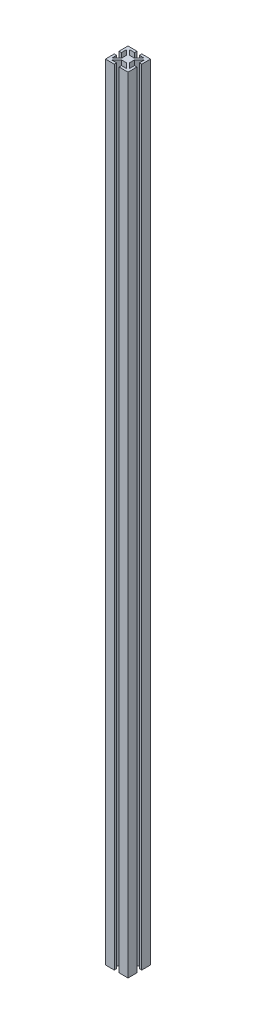
ISO-10303-21;
HEADER;
FILE_DESCRIPTION(('STEP AP214'),'2;1');
FILE_NAME('part.step','',(''),(''),'','','');
FILE_SCHEMA(('AUTOMOTIVE_DESIGN { 1 0 10303 214 1 1 1 1 }'));
ENDSEC;
DATA;
#1=APPLICATION_CONTEXT('core data for automotive mechanical design processes');
#2=APPLICATION_PROTOCOL_DEFINITION('international standard','automotive_design',2000,#1);
#3=PRODUCT_CONTEXT('',#1,'mechanical');
#4=PRODUCT('Part','Part','',(#3));
#5=PRODUCT_RELATED_PRODUCT_CATEGORY('part','',(#4));
#6=PRODUCT_DEFINITION_FORMATION('','',#4);
#7=PRODUCT_DEFINITION_CONTEXT('part definition',#1,'design');
#8=PRODUCT_DEFINITION('design','',#6,#7);
#9=PRODUCT_DEFINITION_SHAPE('','',#8);
#10=(LENGTH_UNIT() NAMED_UNIT(*) SI_UNIT(.MILLI.,.METRE.));
#11=(NAMED_UNIT(*) PLANE_ANGLE_UNIT() SI_UNIT($,.RADIAN.));
#12=(NAMED_UNIT(*) SI_UNIT($,.STERADIAN.) SOLID_ANGLE_UNIT());
#13=UNCERTAINTY_MEASURE_WITH_UNIT(LENGTH_MEASURE(1.E-05),#10,'distance_accuracy_value','');
#14=(GEOMETRIC_REPRESENTATION_CONTEXT(3) GLOBAL_UNCERTAINTY_ASSIGNED_CONTEXT((#13)) GLOBAL_UNIT_ASSIGNED_CONTEXT((#10,
#11,#12)) REPRESENTATION_CONTEXT('',''));
#15=CARTESIAN_POINT('',(0.,0.,0.));
#16=DIRECTION('',(0.,0.,1.));
#17=DIRECTION('',(1.,0.,0.));
#18=AXIS2_PLACEMENT_3D('',#15,#16,#17);
#19=CARTESIAN_POINT('',(-19.05,1320.8,-19.05));
#20=DIRECTION('',(1.,0.,0.));
#21=DIRECTION('',(0.,0.,-1.));
#22=AXIS2_PLACEMENT_3D('',#19,#20,#21);
#23=PLANE('',#22);
#24=DIRECTION('',(0.,0.,1.));
#25=VECTOR('',#24,1.);
#26=CARTESIAN_POINT('',(-19.05,0.,-19.05));
#27=LINE('',#26,#25);
#28=CARTESIAN_POINT('',(-19.05,0.,-19.05));
#29=VERTEX_POINT('',#28);
#30=CARTESIAN_POINT('',(-19.05,0.,-4.06399999999999));
#31=VERTEX_POINT('',#30);
#32=EDGE_CURVE('E299',#29,#31,#27,.T.);
#33=ORIENTED_EDGE('',*,*,#32,.T.);
#34=DIRECTION('',(0.,-1.,0.));
#35=VECTOR('',#34,1.);
#36=CARTESIAN_POINT('',(-19.05,1320.8,-4.06399999999999));
#37=LINE('',#36,#35);
#38=CARTESIAN_POINT('',(-19.05,1320.8,-4.06399999999999));
#39=VERTEX_POINT('',#38);
#40=EDGE_CURVE('E11',#39,#31,#37,.T.);
#41=ORIENTED_EDGE('',*,*,#40,.F.);
#42=DIRECTION('',(0.,0.,1.));
#43=VECTOR('',#42,1.);
#44=CARTESIAN_POINT('',(-19.05,1320.8,-19.05));
#45=LINE('',#44,#43);
#46=CARTESIAN_POINT('',(-19.05,1320.8,-19.05));
#47=VERTEX_POINT('',#46);
#48=EDGE_CURVE('E369',#47,#39,#45,.T.);
#49=ORIENTED_EDGE('',*,*,#48,.F.);
#50=DIRECTION('',(0.,-1.,0.));
#51=VECTOR('',#50,1.);
#52=CARTESIAN_POINT('',(-19.05,1320.8,-19.05));
#53=LINE('',#52,#51);
#54=EDGE_CURVE('E295',#47,#29,#53,.T.);
#55=ORIENTED_EDGE('',*,*,#54,.T.);
#56=EDGE_LOOP('',(#33,#41,#49,#55));
#57=FACE_BOUND('',#56,.T.);
#58=ADVANCED_FACE('F35',(#57),#23,.F.);
#59=CARTESIAN_POINT('',(-19.05,1320.8,-4.06399999999999));
#60=DIRECTION('',(0.,0.,-1.));
#61=DIRECTION('',(-1.,0.,0.));
#62=AXIS2_PLACEMENT_3D('',#59,#60,#61);
#63=PLANE('',#62);
#64=DIRECTION('',(1.,0.,0.));
#65=VECTOR('',#64,1.);
#66=CARTESIAN_POINT('',(-19.05,0.,-4.06399999999999));
#67=LINE('',#66,#65);
#68=CARTESIAN_POINT('',(-14.986,0.,-4.06399999999999));
#69=VERTEX_POINT('',#68);
#70=EDGE_CURVE('E302',#31,#69,#67,.T.);
#71=ORIENTED_EDGE('',*,*,#70,.T.);
#72=DIRECTION('',(0.,-1.,0.));
#73=VECTOR('',#72,1.);
#74=CARTESIAN_POINT('',(-14.986,1320.8,-4.06399999999999));
#75=LINE('',#74,#73);
#76=CARTESIAN_POINT('',(-14.986,1320.8,-4.06399999999999));
#77=VERTEX_POINT('',#76);
#78=EDGE_CURVE('E43',#77,#69,#75,.T.);
#79=ORIENTED_EDGE('',*,*,#78,.F.);
#80=DIRECTION('',(1.,0.,0.));
#81=VECTOR('',#80,1.);
#82=CARTESIAN_POINT('',(-19.05,1320.8,-4.06399999999999));
#83=LINE('',#82,#81);
#84=EDGE_CURVE('E178',#39,#77,#83,.T.);
#85=ORIENTED_EDGE('',*,*,#84,.F.);
#86=ORIENTED_EDGE('',*,*,#40,.T.);
#87=EDGE_LOOP('',(#71,#79,#85,#86));
#88=FACE_BOUND('',#87,.T.);
#89=ADVANCED_FACE('F567',(#88),#63,.F.);
#90=CARTESIAN_POINT('',(-14.986,1320.8,-4.06399999999999));
#91=DIRECTION('',(-1.,0.,0.));
#92=DIRECTION('',(0.,0.,1.));
#93=AXIS2_PLACEMENT_3D('',#90,#91,#92);
#94=PLANE('',#93);
#95=DIRECTION('',(0.,0.,-1.));
#96=VECTOR('',#95,1.);
#97=CARTESIAN_POINT('',(-14.986,0.,-4.06399999999999));
#98=LINE('',#97,#96);
#99=CARTESIAN_POINT('',(-14.986,0.,-12.1123180412578));
#100=VERTEX_POINT('',#99);
#101=EDGE_CURVE('E304',#69,#100,#98,.T.);
#102=ORIENTED_EDGE('',*,*,#101,.T.);
#103=DIRECTION('',(0.,-1.,0.));
#104=VECTOR('',#103,1.);
#105=CARTESIAN_POINT('',(-14.986,1320.8,-12.1123180412578));
#106=LINE('',#105,#104);
#107=CARTESIAN_POINT('',(-14.986,1320.8,-12.1123180412578));
#108=VERTEX_POINT('',#107);
#109=EDGE_CURVE('E460',#108,#100,#106,.T.);
#110=ORIENTED_EDGE('',*,*,#109,.F.);
#111=DIRECTION('',(0.,0.,-1.));
#112=VECTOR('',#111,1.);
#113=CARTESIAN_POINT('',(-14.986,1320.8,-4.06399999999999));
#114=LINE('',#113,#112);
#115=EDGE_CURVE('E468',#77,#108,#114,.T.);
#116=ORIENTED_EDGE('',*,*,#115,.F.);
#117=ORIENTED_EDGE('',*,*,#78,.T.);
#118=EDGE_LOOP('',(#102,#110,#116,#117));
#119=FACE_BOUND('',#118,.T.);
#120=ADVANCED_FACE('F466',(#119),#94,.F.);
#121=CARTESIAN_POINT('',(-14.986,1320.8,-12.1123180412578));
#122=DIRECTION('',(0.707106781186547,0.,-0.707106781186548));
#123=DIRECTION('',(-0.707106781186548,0.,-0.707106781186547));
#124=AXIS2_PLACEMENT_3D('',#121,#122,#123);
#125=PLANE('',#124);
#126=DIRECTION('',(0.707106781186548,0.,0.707106781186547));
#127=VECTOR('',#126,1.);
#128=CARTESIAN_POINT('',(-14.986,0.,-12.1123180412578));
#129=LINE('',#128,#127);
#130=CARTESIAN_POINT('',(-6.7564,0.,-3.88271804125786));
#131=VERTEX_POINT('',#130);
#132=EDGE_CURVE('E306',#100,#131,#129,.T.);
#133=ORIENTED_EDGE('',*,*,#132,.T.);
#134=DIRECTION('',(0.,-1.,0.));
#135=VECTOR('',#134,1.);
#136=CARTESIAN_POINT('',(-6.7564,1320.8,-3.88271804125786));
#137=LINE('',#136,#135);
#138=CARTESIAN_POINT('',(-6.7564,1320.8,-3.88271804125786));
#139=VERTEX_POINT('',#138);
#140=EDGE_CURVE('E457',#139,#131,#137,.T.);
#141=ORIENTED_EDGE('',*,*,#140,.F.);
#142=DIRECTION('',(0.707106781186548,0.,0.707106781186547));
#143=VECTOR('',#142,1.);
#144=CARTESIAN_POINT('',(-14.986,1320.8,-12.1123180412578));
#145=LINE('',#144,#143);
#146=EDGE_CURVE('E486',#108,#139,#145,.T.);
#147=ORIENTED_EDGE('',*,*,#146,.F.);
#148=ORIENTED_EDGE('',*,*,#109,.T.);
#149=EDGE_LOOP('',(#133,#141,#147,#148));
#150=FACE_BOUND('',#149,.T.);
#151=ADVANCED_FACE('F477',(#150),#125,.F.);
#152=CARTESIAN_POINT('',(-6.7564,1320.8,-3.88271804125786));
#153=DIRECTION('',(1.,0.,0.));
#154=DIRECTION('',(0.,0.,-1.));
#155=AXIS2_PLACEMENT_3D('',#152,#153,#154);
#156=PLANE('',#155);
#157=DIRECTION('',(0.,0.,1.));
#158=VECTOR('',#157,1.);
#159=CARTESIAN_POINT('',(-6.7564,0.,-3.88271804125786));
#160=LINE('',#159,#158);
#161=CARTESIAN_POINT('',(-6.7564,0.,3.88271804125787));
#162=VERTEX_POINT('',#161);
#163=EDGE_CURVE('E308',#131,#162,#160,.T.);
#164=ORIENTED_EDGE('',*,*,#163,.T.);
#165=DIRECTION('',(0.,-1.,0.));
#166=VECTOR('',#165,1.);
#167=CARTESIAN_POINT('',(-6.7564,1320.8,3.88271804125787));
#168=LINE('',#167,#166);
#169=CARTESIAN_POINT('',(-6.7564,1320.8,3.88271804125787));
#170=VERTEX_POINT('',#169);
#171=EDGE_CURVE('E454',#170,#162,#168,.T.);
#172=ORIENTED_EDGE('',*,*,#171,.F.);
#173=DIRECTION('',(0.,0.,1.));
#174=VECTOR('',#173,1.);
#175=CARTESIAN_POINT('',(-6.7564,1320.8,-3.88271804125786));
#176=LINE('',#175,#174);
#177=EDGE_CURVE('E483',#139,#170,#176,.T.);
#178=ORIENTED_EDGE('',*,*,#177,.F.);
#179=ORIENTED_EDGE('',*,*,#140,.T.);
#180=EDGE_LOOP('',(#164,#172,#178,#179));
#181=FACE_BOUND('',#180,.T.);
#182=ADVANCED_FACE('F481',(#181),#156,.F.);
#183=CARTESIAN_POINT('',(-14.986,1320.8,12.1123180412579));
#184=DIRECTION('',(0.707106781186548,0.,0.707106781186547));
#185=DIRECTION('',(0.707106781186547,0.,-0.707106781186548));
#186=AXIS2_PLACEMENT_3D('',#183,#184,#185);
#187=PLANE('',#186);
#188=DIRECTION('',(-0.707106781186547,0.,0.707106781186548));
#189=VECTOR('',#188,1.);
#190=CARTESIAN_POINT('',(-14.986,0.,12.1123180412579));
#191=LINE('',#190,#189);
#192=CARTESIAN_POINT('',(-14.986,0.,12.1123180412579));
#193=VERTEX_POINT('',#192);
#194=EDGE_CURVE('E310',#162,#193,#191,.T.);
#195=ORIENTED_EDGE('',*,*,#194,.T.);
#196=DIRECTION('',(0.,-1.,0.));
#197=VECTOR('',#196,1.);
#198=CARTESIAN_POINT('',(-14.986,1320.8,12.1123180412579));
#199=LINE('',#198,#197);
#200=CARTESIAN_POINT('',(-14.986,1320.8,12.1123180412579));
#201=VERTEX_POINT('',#200);
#202=EDGE_CURVE('E451',#201,#193,#199,.T.);
#203=ORIENTED_EDGE('',*,*,#202,.F.);
#204=DIRECTION('',(-0.707106781186547,0.,0.707106781186548));
#205=VECTOR('',#204,1.);
#206=CARTESIAN_POINT('',(-14.986,1320.8,12.1123180412579));
#207=LINE('',#206,#205);
#208=EDGE_CURVE('E485',#170,#201,#207,.T.);
#209=ORIENTED_EDGE('',*,*,#208,.F.);
#210=ORIENTED_EDGE('',*,*,#171,.T.);
#211=EDGE_LOOP('',(#195,#203,#209,#210));
#212=FACE_BOUND('',#211,.T.);
#213=ADVANCED_FACE('F580',(#212),#187,.F.);
#214=CARTESIAN_POINT('',(-14.986,1320.8,4.06399999999999));
#215=DIRECTION('',(-1.,0.,0.));
#216=DIRECTION('',(0.,0.,1.));
#217=AXIS2_PLACEMENT_3D('',#214,#215,#216);
#218=PLANE('',#217);
#219=DIRECTION('',(0.,0.,-1.));
#220=VECTOR('',#219,1.);
#221=CARTESIAN_POINT('',(-14.986,0.,4.06399999999999));
#222=LINE('',#221,#220);
#223=CARTESIAN_POINT('',(-14.986,0.,4.06399999999999));
#224=VERTEX_POINT('',#223);
#225=EDGE_CURVE('E312',#193,#224,#222,.T.);
#226=ORIENTED_EDGE('',*,*,#225,.T.);
#227=DIRECTION('',(0.,-1.,0.));
#228=VECTOR('',#227,1.);
#229=CARTESIAN_POINT('',(-14.986,1320.8,4.06399999999999));
#230=LINE('',#229,#228);
#231=CARTESIAN_POINT('',(-14.986,1320.8,4.06399999999999));
#232=VERTEX_POINT('',#231);
#233=EDGE_CURVE('E448',#232,#224,#230,.T.);
#234=ORIENTED_EDGE('',*,*,#233,.F.);
#235=DIRECTION('',(0.,0.,-1.));
#236=VECTOR('',#235,1.);
#237=CARTESIAN_POINT('',(-14.986,1320.8,4.06399999999999));
#238=LINE('',#237,#236);
#239=EDGE_CURVE('E488',#201,#232,#238,.T.);
#240=ORIENTED_EDGE('',*,*,#239,.F.);
#241=ORIENTED_EDGE('',*,*,#202,.T.);
#242=EDGE_LOOP('',(#226,#234,#240,#241));
#243=FACE_BOUND('',#242,.T.);
#244=ADVANCED_FACE('F583',(#243),#218,.F.);
#245=CARTESIAN_POINT('',(-19.05,1320.8,4.06399999999999));
#246=DIRECTION('',(0.,0.,1.));
#247=DIRECTION('',(1.,0.,0.));
#248=AXIS2_PLACEMENT_3D('',#245,#246,#247);
#249=PLANE('',#248);
#250=DIRECTION('',(-1.,0.,0.));
#251=VECTOR('',#250,1.);
#252=CARTESIAN_POINT('',(-19.05,0.,4.06399999999999));
#253=LINE('',#252,#251);
#254=CARTESIAN_POINT('',(-19.05,0.,4.06399999999999));
#255=VERTEX_POINT('',#254);
#256=EDGE_CURVE('E314',#224,#255,#253,.T.);
#257=ORIENTED_EDGE('',*,*,#256,.T.);
#258=DIRECTION('',(0.,-1.,0.));
#259=VECTOR('',#258,1.);
#260=CARTESIAN_POINT('',(-19.05,1320.8,4.06399999999999));
#261=LINE('',#260,#259);
#262=CARTESIAN_POINT('',(-19.05,1320.8,4.06399999999999));
#263=VERTEX_POINT('',#262);
#264=EDGE_CURVE('E445',#263,#255,#261,.T.);
#265=ORIENTED_EDGE('',*,*,#264,.F.);
#266=DIRECTION('',(-1.,0.,0.));
#267=VECTOR('',#266,1.);
#268=CARTESIAN_POINT('',(-19.05,1320.8,4.06399999999999));
#269=LINE('',#268,#267);
#270=EDGE_CURVE('E494',#232,#263,#269,.T.);
#271=ORIENTED_EDGE('',*,*,#270,.F.);
#272=ORIENTED_EDGE('',*,*,#233,.T.);
#273=EDGE_LOOP('',(#257,#265,#271,#272));
#274=FACE_BOUND('',#273,.T.);
#275=ADVANCED_FACE('F587',(#274),#249,.F.);
#276=CARTESIAN_POINT('',(-19.05,1320.8,19.05));
#277=DIRECTION('',(1.,0.,0.));
#278=DIRECTION('',(0.,0.,-1.));
#279=AXIS2_PLACEMENT_3D('',#276,#277,#278);
#280=PLANE('',#279);
#281=DIRECTION('',(0.,0.,1.));
#282=VECTOR('',#281,1.);
#283=CARTESIAN_POINT('',(-19.05,0.,19.05));
#284=LINE('',#283,#282);
#285=CARTESIAN_POINT('',(-19.05,0.,19.05));
#286=VERTEX_POINT('',#285);
#287=EDGE_CURVE('E316',#255,#286,#284,.T.);
#288=ORIENTED_EDGE('',*,*,#287,.T.);
#289=DIRECTION('',(0.,-1.,0.));
#290=VECTOR('',#289,1.);
#291=CARTESIAN_POINT('',(-19.05,1320.8,19.05));
#292=LINE('',#291,#290);
#293=CARTESIAN_POINT('',(-19.05,1320.8,19.05));
#294=VERTEX_POINT('',#293);
#295=EDGE_CURVE('E442',#294,#286,#292,.T.);
#296=ORIENTED_EDGE('',*,*,#295,.F.);
#297=DIRECTION('',(0.,0.,1.));
#298=VECTOR('',#297,1.);
#299=CARTESIAN_POINT('',(-19.05,1320.8,19.05));
#300=LINE('',#299,#298);
#301=EDGE_CURVE('E496',#263,#294,#300,.T.);
#302=ORIENTED_EDGE('',*,*,#301,.F.);
#303=ORIENTED_EDGE('',*,*,#264,.T.);
#304=EDGE_LOOP('',(#288,#296,#302,#303));
#305=FACE_BOUND('',#304,.T.);
#306=ADVANCED_FACE('F591',(#305),#280,.F.);
#307=CARTESIAN_POINT('',(-19.05,1320.8,19.05));
#308=DIRECTION('',(0.,0.,-1.));
#309=DIRECTION('',(-1.,0.,0.));
#310=AXIS2_PLACEMENT_3D('',#307,#308,#309);
#311=PLANE('',#310);
#312=DIRECTION('',(1.,0.,0.));
#313=VECTOR('',#312,1.);
#314=CARTESIAN_POINT('',(-19.05,0.,19.05));
#315=LINE('',#314,#313);
#316=CARTESIAN_POINT('',(-4.064,0.,19.05));
#317=VERTEX_POINT('',#316);
#318=EDGE_CURVE('E318',#286,#317,#315,.T.);
#319=ORIENTED_EDGE('',*,*,#318,.T.);
#320=DIRECTION('',(0.,-1.,0.));
#321=VECTOR('',#320,1.);
#322=CARTESIAN_POINT('',(-4.064,1320.8,19.05));
#323=LINE('',#322,#321);
#324=CARTESIAN_POINT('',(-4.064,1320.8,19.05));
#325=VERTEX_POINT('',#324);
#326=EDGE_CURVE('E439',#325,#317,#323,.T.);
#327=ORIENTED_EDGE('',*,*,#326,.F.);
#328=DIRECTION('',(1.,0.,0.));
#329=VECTOR('',#328,1.);
#330=CARTESIAN_POINT('',(-19.05,1320.8,19.05));
#331=LINE('',#330,#329);
#332=EDGE_CURVE('E498',#294,#325,#331,.T.);
#333=ORIENTED_EDGE('',*,*,#332,.F.);
#334=ORIENTED_EDGE('',*,*,#295,.T.);
#335=EDGE_LOOP('',(#319,#327,#333,#334));
#336=FACE_BOUND('',#335,.T.);
#337=ADVANCED_FACE('F595',(#336),#311,.F.);
#338=CARTESIAN_POINT('',(-4.064,1320.8,19.05));
#339=DIRECTION('',(-1.,0.,0.));
#340=DIRECTION('',(0.,0.,1.));
#341=AXIS2_PLACEMENT_3D('',#338,#339,#340);
#342=PLANE('',#341);
#343=DIRECTION('',(0.,0.,-1.));
#344=VECTOR('',#343,1.);
#345=CARTESIAN_POINT('',(-4.064,0.,19.05));
#346=LINE('',#345,#344);
#347=CARTESIAN_POINT('',(-4.064,0.,14.986));
#348=VERTEX_POINT('',#347);
#349=EDGE_CURVE('E320',#317,#348,#346,.T.);
#350=ORIENTED_EDGE('',*,*,#349,.T.);
#351=DIRECTION('',(0.,-1.,0.));
#352=VECTOR('',#351,1.);
#353=CARTESIAN_POINT('',(-4.064,1320.8,14.986));
#354=LINE('',#353,#352);
#355=CARTESIAN_POINT('',(-4.064,1320.8,14.986));
#356=VERTEX_POINT('',#355);
#357=EDGE_CURVE('E436',#356,#348,#354,.T.);
#358=ORIENTED_EDGE('',*,*,#357,.F.);
#359=DIRECTION('',(0.,0.,-1.));
#360=VECTOR('',#359,1.);
#361=CARTESIAN_POINT('',(-4.064,1320.8,19.05));
#362=LINE('',#361,#360);
#363=EDGE_CURVE('E500',#325,#356,#362,.T.);
#364=ORIENTED_EDGE('',*,*,#363,.F.);
#365=ORIENTED_EDGE('',*,*,#326,.T.);
#366=EDGE_LOOP('',(#350,#358,#364,#365));
#367=FACE_BOUND('',#366,.T.);
#368=ADVANCED_FACE('F599',(#367),#342,.F.);
#369=CARTESIAN_POINT('',(-4.064,1320.8,14.986));
#370=DIRECTION('',(0.,0.,1.));
#371=DIRECTION('',(1.,0.,0.));
#372=AXIS2_PLACEMENT_3D('',#369,#370,#371);
#373=PLANE('',#372);
#374=DIRECTION('',(-1.,0.,0.));
#375=VECTOR('',#374,1.);
#376=CARTESIAN_POINT('',(-4.064,0.,14.986));
#377=LINE('',#376,#375);
#378=CARTESIAN_POINT('',(-12.1123180412579,0.,14.986));
#379=VERTEX_POINT('',#378);
#380=EDGE_CURVE('E322',#348,#379,#377,.T.);
#381=ORIENTED_EDGE('',*,*,#380,.T.);
#382=DIRECTION('',(0.,-1.,0.));
#383=VECTOR('',#382,1.);
#384=CARTESIAN_POINT('',(-12.1123180412579,1320.8,14.986));
#385=LINE('',#384,#383);
#386=CARTESIAN_POINT('',(-12.1123180412579,1320.8,14.986));
#387=VERTEX_POINT('',#386);
#388=EDGE_CURVE('E433',#387,#379,#385,.T.);
#389=ORIENTED_EDGE('',*,*,#388,.F.);
#390=DIRECTION('',(-1.,0.,0.));
#391=VECTOR('',#390,1.);
#392=CARTESIAN_POINT('',(-4.064,1320.8,14.986));
#393=LINE('',#392,#391);
#394=EDGE_CURVE('E502',#356,#387,#393,.T.);
#395=ORIENTED_EDGE('',*,*,#394,.F.);
#396=ORIENTED_EDGE('',*,*,#357,.T.);
#397=EDGE_LOOP('',(#381,#389,#395,#396));
#398=FACE_BOUND('',#397,.T.);
#399=ADVANCED_FACE('F603',(#398),#373,.F.);
#400=CARTESIAN_POINT('',(-12.1123180412579,1320.8,14.986));
#401=DIRECTION('',(-0.707106781186548,0.,-0.707106781186547));
#402=DIRECTION('',(-0.707106781186547,0.,0.707106781186548));
#403=AXIS2_PLACEMENT_3D('',#400,#401,#402);
#404=PLANE('',#403);
#405=DIRECTION('',(0.707106781186547,0.,-0.707106781186548));
#406=VECTOR('',#405,1.);
#407=CARTESIAN_POINT('',(-12.1123180412579,0.,14.986));
#408=LINE('',#407,#406);
#409=CARTESIAN_POINT('',(-3.88271804125786,0.,6.7564));
#410=VERTEX_POINT('',#409);
#411=EDGE_CURVE('E324',#379,#410,#408,.T.);
#412=ORIENTED_EDGE('',*,*,#411,.T.);
#413=DIRECTION('',(0.,-1.,0.));
#414=VECTOR('',#413,1.);
#415=CARTESIAN_POINT('',(-3.88271804125786,1320.8,6.7564));
#416=LINE('',#415,#414);
#417=CARTESIAN_POINT('',(-3.88271804125786,1320.8,6.7564));
#418=VERTEX_POINT('',#417);
#419=EDGE_CURVE('E430',#418,#410,#416,.T.);
#420=ORIENTED_EDGE('',*,*,#419,.F.);
#421=DIRECTION('',(0.707106781186547,0.,-0.707106781186548));
#422=VECTOR('',#421,1.);
#423=CARTESIAN_POINT('',(-12.1123180412579,1320.8,14.986));
#424=LINE('',#423,#422);
#425=EDGE_CURVE('E504',#387,#418,#424,.T.);
#426=ORIENTED_EDGE('',*,*,#425,.F.);
#427=ORIENTED_EDGE('',*,*,#388,.T.);
#428=EDGE_LOOP('',(#412,#420,#426,#427));
#429=FACE_BOUND('',#428,.T.);
#430=ADVANCED_FACE('F607',(#429),#404,.F.);
#431=CARTESIAN_POINT('',(-3.88271804125786,1320.8,6.7564));
#432=DIRECTION('',(0.,0.,-1.));
#433=DIRECTION('',(-1.,0.,0.));
#434=AXIS2_PLACEMENT_3D('',#431,#432,#433);
#435=PLANE('',#434);
#436=DIRECTION('',(1.,0.,0.));
#437=VECTOR('',#436,1.);
#438=CARTESIAN_POINT('',(-3.88271804125786,0.,6.7564));
#439=LINE('',#438,#437);
#440=CARTESIAN_POINT('',(3.88271804125786,0.,6.7564));
#441=VERTEX_POINT('',#440);
#442=EDGE_CURVE('E326',#410,#441,#439,.T.);
#443=ORIENTED_EDGE('',*,*,#442,.T.);
#444=DIRECTION('',(0.,-1.,0.));
#445=VECTOR('',#444,1.);
#446=CARTESIAN_POINT('',(3.88271804125786,1320.8,6.7564));
#447=LINE('',#446,#445);
#448=CARTESIAN_POINT('',(3.88271804125786,1320.8,6.7564));
#449=VERTEX_POINT('',#448);
#450=EDGE_CURVE('E427',#449,#441,#447,.T.);
#451=ORIENTED_EDGE('',*,*,#450,.F.);
#452=DIRECTION('',(1.,0.,0.));
#453=VECTOR('',#452,1.);
#454=CARTESIAN_POINT('',(-3.88271804125786,1320.8,6.7564));
#455=LINE('',#454,#453);
#456=EDGE_CURVE('E506',#418,#449,#455,.T.);
#457=ORIENTED_EDGE('',*,*,#456,.F.);
#458=ORIENTED_EDGE('',*,*,#419,.T.);
#459=EDGE_LOOP('',(#443,#451,#457,#458));
#460=FACE_BOUND('',#459,.T.);
#461=ADVANCED_FACE('F611',(#460),#435,.F.);
#462=CARTESIAN_POINT('',(12.1123180412579,1320.8,14.986));
#463=DIRECTION('',(0.707106781186547,0.,-0.707106781186547));
#464=DIRECTION('',(-0.707106781186548,0.,-0.707106781186548));
#465=AXIS2_PLACEMENT_3D('',#462,#463,#464);
#466=PLANE('',#465);
#467=DIRECTION('',(0.707106781186547,0.,0.707106781186547));
#468=VECTOR('',#467,1.);
#469=CARTESIAN_POINT('',(12.1123180412579,0.,14.986));
#470=LINE('',#469,#468);
#471=CARTESIAN_POINT('',(12.1123180412579,0.,14.986));
#472=VERTEX_POINT('',#471);
#473=EDGE_CURVE('E328',#441,#472,#470,.T.);
#474=ORIENTED_EDGE('',*,*,#473,.T.);
#475=DIRECTION('',(0.,-1.,0.));
#476=VECTOR('',#475,1.);
#477=CARTESIAN_POINT('',(12.1123180412579,1320.8,14.986));
#478=LINE('',#477,#476);
#479=CARTESIAN_POINT('',(12.1123180412579,1320.8,14.986));
#480=VERTEX_POINT('',#479);
#481=EDGE_CURVE('E424',#480,#472,#478,.T.);
#482=ORIENTED_EDGE('',*,*,#481,.F.);
#483=DIRECTION('',(0.707106781186547,0.,0.707106781186547));
#484=VECTOR('',#483,1.);
#485=CARTESIAN_POINT('',(12.1123180412579,1320.8,14.986));
#486=LINE('',#485,#484);
#487=EDGE_CURVE('E508',#449,#480,#486,.T.);
#488=ORIENTED_EDGE('',*,*,#487,.F.);
#489=ORIENTED_EDGE('',*,*,#450,.T.);
#490=EDGE_LOOP('',(#474,#482,#488,#489));
#491=FACE_BOUND('',#490,.T.);
#492=ADVANCED_FACE('F615',(#491),#466,.F.);
#493=CARTESIAN_POINT('',(4.064,1320.8,14.986));
#494=DIRECTION('',(0.,0.,1.));
#495=DIRECTION('',(1.,0.,0.));
#496=AXIS2_PLACEMENT_3D('',#493,#494,#495);
#497=PLANE('',#496);
#498=DIRECTION('',(-1.,0.,0.));
#499=VECTOR('',#498,1.);
#500=CARTESIAN_POINT('',(4.064,0.,14.986));
#501=LINE('',#500,#499);
#502=CARTESIAN_POINT('',(4.064,0.,14.986));
#503=VERTEX_POINT('',#502);
#504=EDGE_CURVE('E330',#472,#503,#501,.T.);
#505=ORIENTED_EDGE('',*,*,#504,.T.);
#506=DIRECTION('',(0.,-1.,0.));
#507=VECTOR('',#506,1.);
#508=CARTESIAN_POINT('',(4.064,1320.8,14.986));
#509=LINE('',#508,#507);
#510=CARTESIAN_POINT('',(4.064,1320.8,14.986));
#511=VERTEX_POINT('',#510);
#512=EDGE_CURVE('E421',#511,#503,#509,.T.);
#513=ORIENTED_EDGE('',*,*,#512,.F.);
#514=DIRECTION('',(-1.,0.,0.));
#515=VECTOR('',#514,1.);
#516=CARTESIAN_POINT('',(4.064,1320.8,14.986));
#517=LINE('',#516,#515);
#518=EDGE_CURVE('E510',#480,#511,#517,.T.);
#519=ORIENTED_EDGE('',*,*,#518,.F.);
#520=ORIENTED_EDGE('',*,*,#481,.T.);
#521=EDGE_LOOP('',(#505,#513,#519,#520));
#522=FACE_BOUND('',#521,.T.);
#523=ADVANCED_FACE('F619',(#522),#497,.F.);
#524=CARTESIAN_POINT('',(4.06400000000001,1320.8,19.05));
#525=DIRECTION('',(1.,0.,0.));
#526=DIRECTION('',(0.,0.,-1.));
#527=AXIS2_PLACEMENT_3D('',#524,#525,#526);
#528=PLANE('',#527);
#529=DIRECTION('',(0.,0.,1.));
#530=VECTOR('',#529,1.);
#531=CARTESIAN_POINT('',(4.06400000000001,0.,19.05));
#532=LINE('',#531,#530);
#533=CARTESIAN_POINT('',(4.06400000000001,0.,19.05));
#534=VERTEX_POINT('',#533);
#535=EDGE_CURVE('E332',#503,#534,#532,.T.);
#536=ORIENTED_EDGE('',*,*,#535,.T.);
#537=DIRECTION('',(0.,-1.,0.));
#538=VECTOR('',#537,1.);
#539=CARTESIAN_POINT('',(4.06400000000001,1320.8,19.05));
#540=LINE('',#539,#538);
#541=CARTESIAN_POINT('',(4.06400000000001,1320.8,19.05));
#542=VERTEX_POINT('',#541);
#543=EDGE_CURVE('E418',#542,#534,#540,.T.);
#544=ORIENTED_EDGE('',*,*,#543,.F.);
#545=DIRECTION('',(0.,0.,1.));
#546=VECTOR('',#545,1.);
#547=CARTESIAN_POINT('',(4.06400000000001,1320.8,19.05));
#548=LINE('',#547,#546);
#549=EDGE_CURVE('E512',#511,#542,#548,.T.);
#550=ORIENTED_EDGE('',*,*,#549,.F.);
#551=ORIENTED_EDGE('',*,*,#512,.T.);
#552=EDGE_LOOP('',(#536,#544,#550,#551));
#553=FACE_BOUND('',#552,.T.);
#554=ADVANCED_FACE('F623',(#553),#528,.F.);
#555=CARTESIAN_POINT('',(19.05,1320.8,19.05));
#556=DIRECTION('',(0.,0.,-1.));
#557=DIRECTION('',(-1.,0.,0.));
#558=AXIS2_PLACEMENT_3D('',#555,#556,#557);
#559=PLANE('',#558);
#560=DIRECTION('',(1.,0.,0.));
#561=VECTOR('',#560,1.);
#562=CARTESIAN_POINT('',(19.05,0.,19.05));
#563=LINE('',#562,#561);
#564=CARTESIAN_POINT('',(19.05,0.,19.05));
#565=VERTEX_POINT('',#564);
#566=EDGE_CURVE('E334',#534,#565,#563,.T.);
#567=ORIENTED_EDGE('',*,*,#566,.T.);
#568=DIRECTION('',(0.,-1.,0.));
#569=VECTOR('',#568,1.);
#570=CARTESIAN_POINT('',(19.05,1320.8,19.05));
#571=LINE('',#570,#569);
#572=CARTESIAN_POINT('',(19.05,1320.8,19.05));
#573=VERTEX_POINT('',#572);
#574=EDGE_CURVE('E415',#573,#565,#571,.T.);
#575=ORIENTED_EDGE('',*,*,#574,.F.);
#576=DIRECTION('',(1.,0.,0.));
#577=VECTOR('',#576,1.);
#578=CARTESIAN_POINT('',(19.05,1320.8,19.05));
#579=LINE('',#578,#577);
#580=EDGE_CURVE('E514',#542,#573,#579,.T.);
#581=ORIENTED_EDGE('',*,*,#580,.F.);
#582=ORIENTED_EDGE('',*,*,#543,.T.);
#583=EDGE_LOOP('',(#567,#575,#581,#582));
#584=FACE_BOUND('',#583,.T.);
#585=ADVANCED_FACE('F627',(#584),#559,.F.);
#586=CARTESIAN_POINT('',(19.05,1320.8,19.05));
#587=DIRECTION('',(-1.,0.,0.));
#588=DIRECTION('',(0.,0.,1.));
#589=AXIS2_PLACEMENT_3D('',#586,#587,#588);
#590=PLANE('',#589);
#591=DIRECTION('',(0.,0.,-1.));
#592=VECTOR('',#591,1.);
#593=CARTESIAN_POINT('',(19.05,0.,19.05));
#594=LINE('',#593,#592);
#595=CARTESIAN_POINT('',(19.05,0.,4.06399999999999));
#596=VERTEX_POINT('',#595);
#597=EDGE_CURVE('E336',#565,#596,#594,.T.);
#598=ORIENTED_EDGE('',*,*,#597,.T.);
#599=DIRECTION('',(0.,-1.,0.));
#600=VECTOR('',#599,1.);
#601=CARTESIAN_POINT('',(19.05,1320.8,4.06399999999999));
#602=LINE('',#601,#600);
#603=CARTESIAN_POINT('',(19.05,1320.8,4.06399999999999));
#604=VERTEX_POINT('',#603);
#605=EDGE_CURVE('E412',#604,#596,#602,.T.);
#606=ORIENTED_EDGE('',*,*,#605,.F.);
#607=DIRECTION('',(0.,0.,-1.));
#608=VECTOR('',#607,1.);
#609=CARTESIAN_POINT('',(19.05,1320.8,19.05));
#610=LINE('',#609,#608);
#611=EDGE_CURVE('E516',#573,#604,#610,.T.);
#612=ORIENTED_EDGE('',*,*,#611,.F.);
#613=ORIENTED_EDGE('',*,*,#574,.T.);
#614=EDGE_LOOP('',(#598,#606,#612,#613));
#615=FACE_BOUND('',#614,.T.);
#616=ADVANCED_FACE('F631',(#615),#590,.F.);
#617=CARTESIAN_POINT('',(19.05,1320.8,4.06399999999999));
#618=DIRECTION('',(0.,0.,1.));
#619=DIRECTION('',(1.,0.,0.));
#620=AXIS2_PLACEMENT_3D('',#617,#618,#619);
#621=PLANE('',#620);
#622=DIRECTION('',(-1.,0.,0.));
#623=VECTOR('',#622,1.);
#624=CARTESIAN_POINT('',(19.05,0.,4.06399999999999));
#625=LINE('',#624,#623);
#626=CARTESIAN_POINT('',(14.986,0.,4.06399999999999));
#627=VERTEX_POINT('',#626);
#628=EDGE_CURVE('E338',#596,#627,#625,.T.);
#629=ORIENTED_EDGE('',*,*,#628,.T.);
#630=DIRECTION('',(0.,-1.,0.));
#631=VECTOR('',#630,1.);
#632=CARTESIAN_POINT('',(14.986,1320.8,4.06399999999999));
#633=LINE('',#632,#631);
#634=CARTESIAN_POINT('',(14.986,1320.8,4.06399999999999));
#635=VERTEX_POINT('',#634);
#636=EDGE_CURVE('E409',#635,#627,#633,.T.);
#637=ORIENTED_EDGE('',*,*,#636,.F.);
#638=DIRECTION('',(-1.,0.,0.));
#639=VECTOR('',#638,1.);
#640=CARTESIAN_POINT('',(19.05,1320.8,4.06399999999999));
#641=LINE('',#640,#639);
#642=EDGE_CURVE('E518',#604,#635,#641,.T.);
#643=ORIENTED_EDGE('',*,*,#642,.F.);
#644=ORIENTED_EDGE('',*,*,#605,.T.);
#645=EDGE_LOOP('',(#629,#637,#643,#644));
#646=FACE_BOUND('',#645,.T.);
#647=ADVANCED_FACE('F635',(#646),#621,.F.);
#648=CARTESIAN_POINT('',(14.986,1320.8,4.06399999999999));
#649=DIRECTION('',(1.,0.,0.));
#650=DIRECTION('',(0.,0.,-1.));
#651=AXIS2_PLACEMENT_3D('',#648,#649,#650);
#652=PLANE('',#651);
#653=DIRECTION('',(0.,0.,1.));
#654=VECTOR('',#653,1.);
#655=CARTESIAN_POINT('',(14.986,0.,4.06399999999999));
#656=LINE('',#655,#654);
#657=CARTESIAN_POINT('',(14.986,0.,12.1123180412579));
#658=VERTEX_POINT('',#657);
#659=EDGE_CURVE('E340',#627,#658,#656,.T.);
#660=ORIENTED_EDGE('',*,*,#659,.T.);
#661=DIRECTION('',(0.,-1.,0.));
#662=VECTOR('',#661,1.);
#663=CARTESIAN_POINT('',(14.986,1320.8,12.1123180412579));
#664=LINE('',#663,#662);
#665=CARTESIAN_POINT('',(14.986,1320.8,12.1123180412579));
#666=VERTEX_POINT('',#665);
#667=EDGE_CURVE('E406',#666,#658,#664,.T.);
#668=ORIENTED_EDGE('',*,*,#667,.F.);
#669=DIRECTION('',(0.,0.,1.));
#670=VECTOR('',#669,1.);
#671=CARTESIAN_POINT('',(14.986,1320.8,4.06399999999999));
#672=LINE('',#671,#670);
#673=EDGE_CURVE('E520',#635,#666,#672,.T.);
#674=ORIENTED_EDGE('',*,*,#673,.F.);
#675=ORIENTED_EDGE('',*,*,#636,.T.);
#676=EDGE_LOOP('',(#660,#668,#674,#675));
#677=FACE_BOUND('',#676,.T.);
#678=ADVANCED_FACE('F639',(#677),#652,.F.);
#679=CARTESIAN_POINT('',(14.986,1320.8,12.1123180412579));
#680=DIRECTION('',(-0.707106781186547,0.,0.707106781186547));
#681=DIRECTION('',(0.707106781186548,0.,0.707106781186548));
#682=AXIS2_PLACEMENT_3D('',#679,#680,#681);
#683=PLANE('',#682);
#684=DIRECTION('',(-0.707106781186547,0.,-0.707106781186547));
#685=VECTOR('',#684,1.);
#686=CARTESIAN_POINT('',(14.986,0.,12.1123180412579));
#687=LINE('',#686,#685);
#688=CARTESIAN_POINT('',(6.7564,0.,3.88271804125787));
#689=VERTEX_POINT('',#688);
#690=EDGE_CURVE('E342',#658,#689,#687,.T.);
#691=ORIENTED_EDGE('',*,*,#690,.T.);
#692=DIRECTION('',(0.,-1.,0.));
#693=VECTOR('',#692,1.);
#694=CARTESIAN_POINT('',(6.7564,1320.8,3.88271804125787));
#695=LINE('',#694,#693);
#696=CARTESIAN_POINT('',(6.7564,1320.8,3.88271804125787));
#697=VERTEX_POINT('',#696);
#698=EDGE_CURVE('E403',#697,#689,#695,.T.);
#699=ORIENTED_EDGE('',*,*,#698,.F.);
#700=DIRECTION('',(-0.707106781186547,0.,-0.707106781186547));
#701=VECTOR('',#700,1.);
#702=CARTESIAN_POINT('',(14.986,1320.8,12.1123180412579));
#703=LINE('',#702,#701);
#704=EDGE_CURVE('E522',#666,#697,#703,.T.);
#705=ORIENTED_EDGE('',*,*,#704,.F.);
#706=ORIENTED_EDGE('',*,*,#667,.T.);
#707=EDGE_LOOP('',(#691,#699,#705,#706));
#708=FACE_BOUND('',#707,.T.);
#709=ADVANCED_FACE('F643',(#708),#683,.F.);
#710=CARTESIAN_POINT('',(6.7564,1320.8,-3.88271804125786));
#711=DIRECTION('',(-1.,0.,0.));
#712=DIRECTION('',(0.,0.,1.));
#713=AXIS2_PLACEMENT_3D('',#710,#711,#712);
#714=PLANE('',#713);
#715=DIRECTION('',(0.,0.,-1.));
#716=VECTOR('',#715,1.);
#717=CARTESIAN_POINT('',(6.7564,0.,-3.88271804125786));
#718=LINE('',#717,#716);
#719=CARTESIAN_POINT('',(6.7564,0.,-3.88271804125786));
#720=VERTEX_POINT('',#719);
#721=EDGE_CURVE('E344',#689,#720,#718,.T.);
#722=ORIENTED_EDGE('',*,*,#721,.T.);
#723=DIRECTION('',(0.,-1.,0.));
#724=VECTOR('',#723,1.);
#725=CARTESIAN_POINT('',(6.7564,1320.8,-3.88271804125786));
#726=LINE('',#725,#724);
#727=CARTESIAN_POINT('',(6.7564,1320.8,-3.88271804125786));
#728=VERTEX_POINT('',#727);
#729=EDGE_CURVE('E400',#728,#720,#726,.T.);
#730=ORIENTED_EDGE('',*,*,#729,.F.);
#731=DIRECTION('',(0.,0.,-1.));
#732=VECTOR('',#731,1.);
#733=CARTESIAN_POINT('',(6.7564,1320.8,-3.88271804125786));
#734=LINE('',#733,#732);
#735=EDGE_CURVE('E524',#697,#728,#734,.T.);
#736=ORIENTED_EDGE('',*,*,#735,.F.);
#737=ORIENTED_EDGE('',*,*,#698,.T.);
#738=EDGE_LOOP('',(#722,#730,#736,#737));
#739=FACE_BOUND('',#738,.T.);
#740=ADVANCED_FACE('F647',(#739),#714,.F.);
#741=CARTESIAN_POINT('',(14.986,1320.8,-12.1123180412579));
#742=DIRECTION('',(-0.707106781186547,0.,-0.707106781186548));
#743=DIRECTION('',(-0.707106781186548,0.,0.707106781186547));
#744=AXIS2_PLACEMENT_3D('',#741,#742,#743);
#745=PLANE('',#744);
#746=DIRECTION('',(0.707106781186548,0.,-0.707106781186547));
#747=VECTOR('',#746,1.);
#748=CARTESIAN_POINT('',(14.986,0.,-12.1123180412579));
#749=LINE('',#748,#747);
#750=CARTESIAN_POINT('',(14.986,0.,-12.1123180412579));
#751=VERTEX_POINT('',#750);
#752=EDGE_CURVE('E346',#720,#751,#749,.T.);
#753=ORIENTED_EDGE('',*,*,#752,.T.);
#754=DIRECTION('',(0.,-1.,0.));
#755=VECTOR('',#754,1.);
#756=CARTESIAN_POINT('',(14.986,1320.8,-12.1123180412579));
#757=LINE('',#756,#755);
#758=CARTESIAN_POINT('',(14.986,1320.8,-12.1123180412579));
#759=VERTEX_POINT('',#758);
#760=EDGE_CURVE('E397',#759,#751,#757,.T.);
#761=ORIENTED_EDGE('',*,*,#760,.F.);
#762=DIRECTION('',(0.707106781186548,0.,-0.707106781186547));
#763=VECTOR('',#762,1.);
#764=CARTESIAN_POINT('',(14.986,1320.8,-12.1123180412579));
#765=LINE('',#764,#763);
#766=EDGE_CURVE('E526',#728,#759,#765,.T.);
#767=ORIENTED_EDGE('',*,*,#766,.F.);
#768=ORIENTED_EDGE('',*,*,#729,.T.);
#769=EDGE_LOOP('',(#753,#761,#767,#768));
#770=FACE_BOUND('',#769,.T.);
#771=ADVANCED_FACE('F651',(#770),#745,.F.);
#772=CARTESIAN_POINT('',(14.986,1320.8,-4.06399999999999));
#773=DIRECTION('',(1.,0.,0.));
#774=DIRECTION('',(0.,0.,-1.));
#775=AXIS2_PLACEMENT_3D('',#772,#773,#774);
#776=PLANE('',#775);
#777=DIRECTION('',(0.,0.,1.));
#778=VECTOR('',#777,1.);
#779=CARTESIAN_POINT('',(14.986,0.,-4.06399999999999));
#780=LINE('',#779,#778);
#781=CARTESIAN_POINT('',(14.986,0.,-4.06399999999999));
#782=VERTEX_POINT('',#781);
#783=EDGE_CURVE('E348',#751,#782,#780,.T.);
#784=ORIENTED_EDGE('',*,*,#783,.T.);
#785=DIRECTION('',(0.,-1.,0.));
#786=VECTOR('',#785,1.);
#787=CARTESIAN_POINT('',(14.986,1320.8,-4.06399999999999));
#788=LINE('',#787,#786);
#789=CARTESIAN_POINT('',(14.986,1320.8,-4.06399999999999));
#790=VERTEX_POINT('',#789);
#791=EDGE_CURVE('E394',#790,#782,#788,.T.);
#792=ORIENTED_EDGE('',*,*,#791,.F.);
#793=DIRECTION('',(0.,0.,1.));
#794=VECTOR('',#793,1.);
#795=CARTESIAN_POINT('',(14.986,1320.8,-4.06399999999999));
#796=LINE('',#795,#794);
#797=EDGE_CURVE('E528',#759,#790,#796,.T.);
#798=ORIENTED_EDGE('',*,*,#797,.F.);
#799=ORIENTED_EDGE('',*,*,#760,.T.);
#800=EDGE_LOOP('',(#784,#792,#798,#799));
#801=FACE_BOUND('',#800,.T.);
#802=ADVANCED_FACE('F655',(#801),#776,.F.);
#803=CARTESIAN_POINT('',(19.05,1320.8,-4.06399999999999));
#804=DIRECTION('',(0.,0.,-1.));
#805=DIRECTION('',(-1.,0.,0.));
#806=AXIS2_PLACEMENT_3D('',#803,#804,#805);
#807=PLANE('',#806);
#808=DIRECTION('',(1.,0.,0.));
#809=VECTOR('',#808,1.);
#810=CARTESIAN_POINT('',(19.05,0.,-4.06399999999999));
#811=LINE('',#810,#809);
#812=CARTESIAN_POINT('',(19.05,0.,-4.06399999999999));
#813=VERTEX_POINT('',#812);
#814=EDGE_CURVE('E350',#782,#813,#811,.T.);
#815=ORIENTED_EDGE('',*,*,#814,.T.);
#816=DIRECTION('',(0.,-1.,0.));
#817=VECTOR('',#816,1.);
#818=CARTESIAN_POINT('',(19.05,1320.8,-4.06399999999999));
#819=LINE('',#818,#817);
#820=CARTESIAN_POINT('',(19.05,1320.8,-4.06399999999999));
#821=VERTEX_POINT('',#820);
#822=EDGE_CURVE('E391',#821,#813,#819,.T.);
#823=ORIENTED_EDGE('',*,*,#822,.F.);
#824=DIRECTION('',(1.,0.,0.));
#825=VECTOR('',#824,1.);
#826=CARTESIAN_POINT('',(19.05,1320.8,-4.06399999999999));
#827=LINE('',#826,#825);
#828=EDGE_CURVE('E530',#790,#821,#827,.T.);
#829=ORIENTED_EDGE('',*,*,#828,.F.);
#830=ORIENTED_EDGE('',*,*,#791,.T.);
#831=EDGE_LOOP('',(#815,#823,#829,#830));
#832=FACE_BOUND('',#831,.T.);
#833=ADVANCED_FACE('F659',(#832),#807,.F.);
#834=CARTESIAN_POINT('',(19.05,1320.8,-19.05));
#835=DIRECTION('',(-1.,0.,0.));
#836=DIRECTION('',(0.,0.,1.));
#837=AXIS2_PLACEMENT_3D('',#834,#835,#836);
#838=PLANE('',#837);
#839=DIRECTION('',(0.,0.,-1.));
#840=VECTOR('',#839,1.);
#841=CARTESIAN_POINT('',(19.05,0.,-19.05));
#842=LINE('',#841,#840);
#843=CARTESIAN_POINT('',(19.05,0.,-19.05));
#844=VERTEX_POINT('',#843);
#845=EDGE_CURVE('E352',#813,#844,#842,.T.);
#846=ORIENTED_EDGE('',*,*,#845,.T.);
#847=DIRECTION('',(0.,-1.,0.));
#848=VECTOR('',#847,1.);
#849=CARTESIAN_POINT('',(19.05,1320.8,-19.05));
#850=LINE('',#849,#848);
#851=CARTESIAN_POINT('',(19.05,1320.8,-19.05));
#852=VERTEX_POINT('',#851);
#853=EDGE_CURVE('E388',#852,#844,#850,.T.);
#854=ORIENTED_EDGE('',*,*,#853,.F.);
#855=DIRECTION('',(0.,0.,-1.));
#856=VECTOR('',#855,1.);
#857=CARTESIAN_POINT('',(19.05,1320.8,-19.05));
#858=LINE('',#857,#856);
#859=EDGE_CURVE('E532',#821,#852,#858,.T.);
#860=ORIENTED_EDGE('',*,*,#859,.F.);
#861=ORIENTED_EDGE('',*,*,#822,.T.);
#862=EDGE_LOOP('',(#846,#854,#860,#861));
#863=FACE_BOUND('',#862,.T.);
#864=ADVANCED_FACE('F663',(#863),#838,.F.);
#865=CARTESIAN_POINT('',(19.05,1320.8,-19.05));
#866=DIRECTION('',(0.,0.,1.));
#867=DIRECTION('',(1.,0.,0.));
#868=AXIS2_PLACEMENT_3D('',#865,#866,#867);
#869=PLANE('',#868);
#870=DIRECTION('',(-1.,0.,0.));
#871=VECTOR('',#870,1.);
#872=CARTESIAN_POINT('',(19.05,0.,-19.05));
#873=LINE('',#872,#871);
#874=CARTESIAN_POINT('',(4.064,0.,-19.05));
#875=VERTEX_POINT('',#874);
#876=EDGE_CURVE('E354',#844,#875,#873,.T.);
#877=ORIENTED_EDGE('',*,*,#876,.T.);
#878=DIRECTION('',(0.,-1.,0.));
#879=VECTOR('',#878,1.);
#880=CARTESIAN_POINT('',(4.064,1320.8,-19.05));
#881=LINE('',#880,#879);
#882=CARTESIAN_POINT('',(4.064,1320.8,-19.05));
#883=VERTEX_POINT('',#882);
#884=EDGE_CURVE('E385',#883,#875,#881,.T.);
#885=ORIENTED_EDGE('',*,*,#884,.F.);
#886=DIRECTION('',(-1.,0.,0.));
#887=VECTOR('',#886,1.);
#888=CARTESIAN_POINT('',(19.05,1320.8,-19.05));
#889=LINE('',#888,#887);
#890=EDGE_CURVE('E534',#852,#883,#889,.T.);
#891=ORIENTED_EDGE('',*,*,#890,.F.);
#892=ORIENTED_EDGE('',*,*,#853,.T.);
#893=EDGE_LOOP('',(#877,#885,#891,#892));
#894=FACE_BOUND('',#893,.T.);
#895=ADVANCED_FACE('F667',(#894),#869,.F.);
#896=CARTESIAN_POINT('',(4.064,1320.8,-19.05));
#897=DIRECTION('',(1.,0.,0.));
#898=DIRECTION('',(0.,0.,-1.));
#899=AXIS2_PLACEMENT_3D('',#896,#897,#898);
#900=PLANE('',#899);
#901=DIRECTION('',(0.,0.,1.));
#902=VECTOR('',#901,1.);
#903=CARTESIAN_POINT('',(4.064,0.,-19.05));
#904=LINE('',#903,#902);
#905=CARTESIAN_POINT('',(4.064,0.,-14.986));
#906=VERTEX_POINT('',#905);
#907=EDGE_CURVE('E356',#875,#906,#904,.T.);
#908=ORIENTED_EDGE('',*,*,#907,.T.);
#909=DIRECTION('',(0.,-1.,0.));
#910=VECTOR('',#909,1.);
#911=CARTESIAN_POINT('',(4.064,1320.8,-14.986));
#912=LINE('',#911,#910);
#913=CARTESIAN_POINT('',(4.064,1320.8,-14.986));
#914=VERTEX_POINT('',#913);
#915=EDGE_CURVE('E382',#914,#906,#912,.T.);
#916=ORIENTED_EDGE('',*,*,#915,.F.);
#917=DIRECTION('',(0.,0.,1.));
#918=VECTOR('',#917,1.);
#919=CARTESIAN_POINT('',(4.064,1320.8,-19.05));
#920=LINE('',#919,#918);
#921=EDGE_CURVE('E536',#883,#914,#920,.T.);
#922=ORIENTED_EDGE('',*,*,#921,.F.);
#923=ORIENTED_EDGE('',*,*,#884,.T.);
#924=EDGE_LOOP('',(#908,#916,#922,#923));
#925=FACE_BOUND('',#924,.T.);
#926=ADVANCED_FACE('F671',(#925),#900,.F.);
#927=CARTESIAN_POINT('',(4.064,1320.8,-14.986));
#928=DIRECTION('',(0.,0.,-1.));
#929=DIRECTION('',(-1.,0.,0.));
#930=AXIS2_PLACEMENT_3D('',#927,#928,#929);
#931=PLANE('',#930);
#932=DIRECTION('',(1.,0.,0.));
#933=VECTOR('',#932,1.);
#934=CARTESIAN_POINT('',(4.064,0.,-14.986));
#935=LINE('',#934,#933);
#936=CARTESIAN_POINT('',(12.1123180412579,0.,-14.986));
#937=VERTEX_POINT('',#936);
#938=EDGE_CURVE('E358',#906,#937,#935,.T.);
#939=ORIENTED_EDGE('',*,*,#938,.T.);
#940=DIRECTION('',(0.,-1.,0.));
#941=VECTOR('',#940,1.);
#942=CARTESIAN_POINT('',(12.1123180412579,1320.8,-14.986));
#943=LINE('',#942,#941);
#944=CARTESIAN_POINT('',(12.1123180412579,1320.8,-14.986));
#945=VERTEX_POINT('',#944);
#946=EDGE_CURVE('E379',#945,#937,#943,.T.);
#947=ORIENTED_EDGE('',*,*,#946,.F.);
#948=DIRECTION('',(1.,0.,0.));
#949=VECTOR('',#948,1.);
#950=CARTESIAN_POINT('',(4.064,1320.8,-14.986));
#951=LINE('',#950,#949);
#952=EDGE_CURVE('E538',#914,#945,#951,.T.);
#953=ORIENTED_EDGE('',*,*,#952,.F.);
#954=ORIENTED_EDGE('',*,*,#915,.T.);
#955=EDGE_LOOP('',(#939,#947,#953,#954));
#956=FACE_BOUND('',#955,.T.);
#957=ADVANCED_FACE('F675',(#956),#931,.F.);
#958=CARTESIAN_POINT('',(12.1123180412579,1320.8,-14.986));
#959=DIRECTION('',(0.707106781186548,0.,0.707106781186547));
#960=DIRECTION('',(0.707106781186547,0.,-0.707106781186548));
#961=AXIS2_PLACEMENT_3D('',#958,#959,#960);
#962=PLANE('',#961);
#963=DIRECTION('',(-0.707106781186547,0.,0.707106781186548));
#964=VECTOR('',#963,1.);
#965=CARTESIAN_POINT('',(12.1123180412579,0.,-14.986));
#966=LINE('',#965,#964);
#967=CARTESIAN_POINT('',(3.88271804125786,0.,-6.7564));
#968=VERTEX_POINT('',#967);
#969=EDGE_CURVE('E360',#937,#968,#966,.T.);
#970=ORIENTED_EDGE('',*,*,#969,.T.);
#971=DIRECTION('',(0.,-1.,0.));
#972=VECTOR('',#971,1.);
#973=CARTESIAN_POINT('',(3.88271804125786,1320.8,-6.7564));
#974=LINE('',#973,#972);
#975=CARTESIAN_POINT('',(3.88271804125786,1320.8,-6.7564));
#976=VERTEX_POINT('',#975);
#977=EDGE_CURVE('E376',#976,#968,#974,.T.);
#978=ORIENTED_EDGE('',*,*,#977,.F.);
#979=DIRECTION('',(-0.707106781186547,0.,0.707106781186548));
#980=VECTOR('',#979,1.);
#981=CARTESIAN_POINT('',(12.1123180412579,1320.8,-14.986));
#982=LINE('',#981,#980);
#983=EDGE_CURVE('E540',#945,#976,#982,.T.);
#984=ORIENTED_EDGE('',*,*,#983,.F.);
#985=ORIENTED_EDGE('',*,*,#946,.T.);
#986=EDGE_LOOP('',(#970,#978,#984,#985));
#987=FACE_BOUND('',#986,.T.);
#988=ADVANCED_FACE('F679',(#987),#962,.F.);
#989=CARTESIAN_POINT('',(-3.88271804125786,1320.8,-6.7564));
#990=DIRECTION('',(0.,0.,1.));
#991=DIRECTION('',(1.,0.,0.));
#992=AXIS2_PLACEMENT_3D('',#989,#990,#991);
#993=PLANE('',#992);
#994=DIRECTION('',(-1.,0.,0.));
#995=VECTOR('',#994,1.);
#996=CARTESIAN_POINT('',(-3.88271804125786,0.,-6.7564));
#997=LINE('',#996,#995);
#998=CARTESIAN_POINT('',(-3.88271804125786,0.,-6.7564));
#999=VERTEX_POINT('',#998);
#1000=EDGE_CURVE('E362',#968,#999,#997,.T.);
#1001=ORIENTED_EDGE('',*,*,#1000,.T.);
#1002=DIRECTION('',(0.,-1.,0.));
#1003=VECTOR('',#1002,1.);
#1004=CARTESIAN_POINT('',(-3.88271804125786,1320.8,-6.7564));
#1005=LINE('',#1004,#1003);
#1006=CARTESIAN_POINT('',(-3.88271804125786,1320.8,-6.7564));
#1007=VERTEX_POINT('',#1006);
#1008=EDGE_CURVE('E373',#1007,#999,#1005,.T.);
#1009=ORIENTED_EDGE('',*,*,#1008,.F.);
#1010=DIRECTION('',(-1.,0.,0.));
#1011=VECTOR('',#1010,1.);
#1012=CARTESIAN_POINT('',(-3.88271804125786,1320.8,-6.7564));
#1013=LINE('',#1012,#1011);
#1014=EDGE_CURVE('E542',#976,#1007,#1013,.T.);
#1015=ORIENTED_EDGE('',*,*,#1014,.F.);
#1016=ORIENTED_EDGE('',*,*,#977,.T.);
#1017=EDGE_LOOP('',(#1001,#1009,#1015,#1016));
#1018=FACE_BOUND('',#1017,.T.);
#1019=ADVANCED_FACE('F548',(#1018),#993,.F.);
#1020=CARTESIAN_POINT('',(-12.1123180412579,1320.8,-14.986));
#1021=DIRECTION('',(-0.707106781186548,0.,0.707106781186547));
#1022=DIRECTION('',(0.707106781186547,0.,0.707106781186548));
#1023=AXIS2_PLACEMENT_3D('',#1020,#1021,#1022);
#1024=PLANE('',#1023);
#1025=DIRECTION('',(-0.707106781186547,0.,-0.707106781186548));
#1026=VECTOR('',#1025,1.);
#1027=CARTESIAN_POINT('',(-12.1123180412579,0.,-14.986));
#1028=LINE('',#1027,#1026);
#1029=CARTESIAN_POINT('',(-12.1123180412579,0.,-14.986));
#1030=VERTEX_POINT('',#1029);
#1031=EDGE_CURVE('E364',#999,#1030,#1028,.T.);
#1032=ORIENTED_EDGE('',*,*,#1031,.T.);
#1033=DIRECTION('',(0.,-1.,0.));
#1034=VECTOR('',#1033,1.);
#1035=CARTESIAN_POINT('',(-12.1123180412579,1320.8,-14.986));
#1036=LINE('',#1035,#1034);
#1037=CARTESIAN_POINT('',(-12.1123180412579,1320.8,-14.986));
#1038=VERTEX_POINT('',#1037);
#1039=EDGE_CURVE('E290',#1038,#1030,#1036,.T.);
#1040=ORIENTED_EDGE('',*,*,#1039,.F.);
#1041=DIRECTION('',(-0.707106781186547,0.,-0.707106781186548));
#1042=VECTOR('',#1041,1.);
#1043=CARTESIAN_POINT('',(-12.1123180412579,1320.8,-14.986));
#1044=LINE('',#1043,#1042);
#1045=EDGE_CURVE('E281',#1007,#1038,#1044,.T.);
#1046=ORIENTED_EDGE('',*,*,#1045,.F.);
#1047=ORIENTED_EDGE('',*,*,#1008,.T.);
#1048=EDGE_LOOP('',(#1032,#1040,#1046,#1047));
#1049=FACE_BOUND('',#1048,.T.);
#1050=ADVANCED_FACE('F552',(#1049),#1024,.F.);
#1051=CARTESIAN_POINT('',(-4.064,1320.8,-14.986));
#1052=DIRECTION('',(0.,0.,-1.));
#1053=DIRECTION('',(-1.,0.,0.));
#1054=AXIS2_PLACEMENT_3D('',#1051,#1052,#1053);
#1055=PLANE('',#1054);
#1056=DIRECTION('',(1.,0.,0.));
#1057=VECTOR('',#1056,1.);
#1058=CARTESIAN_POINT('',(-4.064,0.,-14.986));
#1059=LINE('',#1058,#1057);
#1060=CARTESIAN_POINT('',(-4.064,0.,-14.986));
#1061=VERTEX_POINT('',#1060);
#1062=EDGE_CURVE('E289',#1030,#1061,#1059,.T.);
#1063=ORIENTED_EDGE('',*,*,#1062,.T.);
#1064=DIRECTION('',(0.,-1.,0.));
#1065=VECTOR('',#1064,1.);
#1066=CARTESIAN_POINT('',(-4.064,1320.8,-14.986));
#1067=LINE('',#1066,#1065);
#1068=CARTESIAN_POINT('',(-4.064,1320.8,-14.986));
#1069=VERTEX_POINT('',#1068);
#1070=EDGE_CURVE('E286',#1069,#1061,#1067,.T.);
#1071=ORIENTED_EDGE('',*,*,#1070,.F.);
#1072=DIRECTION('',(1.,0.,0.));
#1073=VECTOR('',#1072,1.);
#1074=CARTESIAN_POINT('',(-4.064,1320.8,-14.986));
#1075=LINE('',#1074,#1073);
#1076=EDGE_CURVE('E275',#1038,#1069,#1075,.T.);
#1077=ORIENTED_EDGE('',*,*,#1076,.F.);
#1078=ORIENTED_EDGE('',*,*,#1039,.T.);
#1079=EDGE_LOOP('',(#1063,#1071,#1077,#1078));
#1080=FACE_BOUND('',#1079,.T.);
#1081=ADVANCED_FACE('F287',(#1080),#1055,.F.);
#1082=CARTESIAN_POINT('',(-4.064,1320.8,-19.05));
#1083=DIRECTION('',(-1.,0.,0.));
#1084=DIRECTION('',(0.,0.,1.));
#1085=AXIS2_PLACEMENT_3D('',#1082,#1083,#1084);
#1086=PLANE('',#1085);
#1087=DIRECTION('',(0.,0.,-1.));
#1088=VECTOR('',#1087,1.);
#1089=CARTESIAN_POINT('',(-4.064,0.,-19.05));
#1090=LINE('',#1089,#1088);
#1091=CARTESIAN_POINT('',(-4.064,0.,-19.05));
#1092=VERTEX_POINT('',#1091);
#1093=EDGE_CURVE('E164',#1061,#1092,#1090,.T.);
#1094=ORIENTED_EDGE('',*,*,#1093,.T.);
#1095=DIRECTION('',(0.,-1.,0.));
#1096=VECTOR('',#1095,1.);
#1097=CARTESIAN_POINT('',(-4.064,1320.8,-19.05));
#1098=LINE('',#1097,#1096);
#1099=CARTESIAN_POINT('',(-4.064,1320.8,-19.05));
#1100=VERTEX_POINT('',#1099);
#1101=EDGE_CURVE('E291',#1100,#1092,#1098,.T.);
#1102=ORIENTED_EDGE('',*,*,#1101,.F.);
#1103=DIRECTION('',(0.,0.,-1.));
#1104=VECTOR('',#1103,1.);
#1105=CARTESIAN_POINT('',(-4.064,1320.8,-19.05));
#1106=LINE('',#1105,#1104);
#1107=EDGE_CURVE('E279',#1069,#1100,#1106,.T.);
#1108=ORIENTED_EDGE('',*,*,#1107,.F.);
#1109=ORIENTED_EDGE('',*,*,#1070,.T.);
#1110=EDGE_LOOP('',(#1094,#1102,#1108,#1109));
#1111=FACE_BOUND('',#1110,.T.);
#1112=ADVANCED_FACE('F293',(#1111),#1086,.F.);
#1113=CARTESIAN_POINT('',(-19.05,1320.8,-19.05));
#1114=DIRECTION('',(0.,0.,1.));
#1115=DIRECTION('',(1.,0.,0.));
#1116=AXIS2_PLACEMENT_3D('',#1113,#1114,#1115);
#1117=PLANE('',#1116);
#1118=DIRECTION('',(-1.,0.,0.));
#1119=VECTOR('',#1118,1.);
#1120=CARTESIAN_POINT('',(-19.05,0.,-19.05));
#1121=LINE('',#1120,#1119);
#1122=EDGE_CURVE('E170',#1092,#29,#1121,.T.);
#1123=ORIENTED_EDGE('',*,*,#1122,.T.);
#1124=ORIENTED_EDGE('',*,*,#54,.F.);
#1125=DIRECTION('',(-1.,0.,0.));
#1126=VECTOR('',#1125,1.);
#1127=CARTESIAN_POINT('',(-19.05,1320.8,-19.05));
#1128=LINE('',#1127,#1126);
#1129=EDGE_CURVE('E51',#1100,#47,#1128,.T.);
#1130=ORIENTED_EDGE('',*,*,#1129,.F.);
#1131=ORIENTED_EDGE('',*,*,#1101,.T.);
#1132=EDGE_LOOP('',(#1123,#1124,#1130,#1131));
#1133=FACE_BOUND('',#1132,.T.);
#1134=ADVANCED_FACE('F556',(#1133),#1117,.F.);
#1135=CARTESIAN_POINT('',(-19.05,1320.8,-4.06399999999999));
#1136=DIRECTION('',(0.,1.,0.));
#1137=DIRECTION('',(0.,0.,1.));
#1138=AXIS2_PLACEMENT_3D('',#1135,#1136,#1137);
#1139=PLANE('',#1138);
#1140=ORIENTED_EDGE('',*,*,#48,.T.);
#1141=ORIENTED_EDGE('',*,*,#84,.T.);
#1142=ORIENTED_EDGE('',*,*,#115,.T.);
#1143=ORIENTED_EDGE('',*,*,#146,.T.);
#1144=ORIENTED_EDGE('',*,*,#177,.T.);
#1145=ORIENTED_EDGE('',*,*,#208,.T.);
#1146=ORIENTED_EDGE('',*,*,#239,.T.);
#1147=ORIENTED_EDGE('',*,*,#270,.T.);
#1148=ORIENTED_EDGE('',*,*,#301,.T.);
#1149=ORIENTED_EDGE('',*,*,#332,.T.);
#1150=ORIENTED_EDGE('',*,*,#363,.T.);
#1151=ORIENTED_EDGE('',*,*,#394,.T.);
#1152=ORIENTED_EDGE('',*,*,#425,.T.);
#1153=ORIENTED_EDGE('',*,*,#456,.T.);
#1154=ORIENTED_EDGE('',*,*,#487,.T.);
#1155=ORIENTED_EDGE('',*,*,#518,.T.);
#1156=ORIENTED_EDGE('',*,*,#549,.T.);
#1157=ORIENTED_EDGE('',*,*,#580,.T.);
#1158=ORIENTED_EDGE('',*,*,#611,.T.);
#1159=ORIENTED_EDGE('',*,*,#642,.T.);
#1160=ORIENTED_EDGE('',*,*,#673,.T.);
#1161=ORIENTED_EDGE('',*,*,#704,.T.);
#1162=ORIENTED_EDGE('',*,*,#735,.T.);
#1163=ORIENTED_EDGE('',*,*,#766,.T.);
#1164=ORIENTED_EDGE('',*,*,#797,.T.);
#1165=ORIENTED_EDGE('',*,*,#828,.T.);
#1166=ORIENTED_EDGE('',*,*,#859,.T.);
#1167=ORIENTED_EDGE('',*,*,#890,.T.);
#1168=ORIENTED_EDGE('',*,*,#921,.T.);
#1169=ORIENTED_EDGE('',*,*,#952,.T.);
#1170=ORIENTED_EDGE('',*,*,#983,.T.);
#1171=ORIENTED_EDGE('',*,*,#1014,.T.);
#1172=ORIENTED_EDGE('',*,*,#1045,.T.);
#1173=ORIENTED_EDGE('',*,*,#1076,.T.);
#1174=ORIENTED_EDGE('',*,*,#1107,.T.);
#1175=ORIENTED_EDGE('',*,*,#1129,.T.);
#1176=EDGE_LOOP('',(#1140,#1141,#1142,#1143,#1144,#1145,#1146,#1147,#1148,#1149,#1150,#1151,
#1152,#1153,#1154,#1155,#1156,#1157,#1158,#1159,#1160,#1161,#1162,#1163,#1164,#1165,#1166,#1167,
#1168,#1169,#1170,#1171,#1172,#1173,#1174,#1175));
#1177=FACE_BOUND('',#1176,.T.);
#1178=ADVANCED_FACE('F277',(#1177),#1139,.T.);
#1179=CARTESIAN_POINT('',(-19.05,0.,-4.06399999999999));
#1180=DIRECTION('',(0.,1.,0.));
#1181=DIRECTION('',(0.,0.,1.));
#1182=AXIS2_PLACEMENT_3D('',#1179,#1180,#1181);
#1183=PLANE('',#1182);
#1184=ORIENTED_EDGE('',*,*,#32,.F.);
#1185=ORIENTED_EDGE('',*,*,#1122,.F.);
#1186=ORIENTED_EDGE('',*,*,#1093,.F.);
#1187=ORIENTED_EDGE('',*,*,#1062,.F.);
#1188=ORIENTED_EDGE('',*,*,#1031,.F.);
#1189=ORIENTED_EDGE('',*,*,#1000,.F.);
#1190=ORIENTED_EDGE('',*,*,#969,.F.);
#1191=ORIENTED_EDGE('',*,*,#938,.F.);
#1192=ORIENTED_EDGE('',*,*,#907,.F.);
#1193=ORIENTED_EDGE('',*,*,#876,.F.);
#1194=ORIENTED_EDGE('',*,*,#845,.F.);
#1195=ORIENTED_EDGE('',*,*,#814,.F.);
#1196=ORIENTED_EDGE('',*,*,#783,.F.);
#1197=ORIENTED_EDGE('',*,*,#752,.F.);
#1198=ORIENTED_EDGE('',*,*,#721,.F.);
#1199=ORIENTED_EDGE('',*,*,#690,.F.);
#1200=ORIENTED_EDGE('',*,*,#659,.F.);
#1201=ORIENTED_EDGE('',*,*,#628,.F.);
#1202=ORIENTED_EDGE('',*,*,#597,.F.);
#1203=ORIENTED_EDGE('',*,*,#566,.F.);
#1204=ORIENTED_EDGE('',*,*,#535,.F.);
#1205=ORIENTED_EDGE('',*,*,#504,.F.);
#1206=ORIENTED_EDGE('',*,*,#473,.F.);
#1207=ORIENTED_EDGE('',*,*,#442,.F.);
#1208=ORIENTED_EDGE('',*,*,#411,.F.);
#1209=ORIENTED_EDGE('',*,*,#380,.F.);
#1210=ORIENTED_EDGE('',*,*,#349,.F.);
#1211=ORIENTED_EDGE('',*,*,#318,.F.);
#1212=ORIENTED_EDGE('',*,*,#287,.F.);
#1213=ORIENTED_EDGE('',*,*,#256,.F.);
#1214=ORIENTED_EDGE('',*,*,#225,.F.);
#1215=ORIENTED_EDGE('',*,*,#194,.F.);
#1216=ORIENTED_EDGE('',*,*,#163,.F.);
#1217=ORIENTED_EDGE('',*,*,#132,.F.);
#1218=ORIENTED_EDGE('',*,*,#101,.F.);
#1219=ORIENTED_EDGE('',*,*,#70,.F.);
#1220=EDGE_LOOP('',(#1184,#1185,#1186,#1187,#1188,#1189,#1190,#1191,#1192,#1193,#1194,#1195,
#1196,#1197,#1198,#1199,#1200,#1201,#1202,#1203,#1204,#1205,#1206,#1207,#1208,#1209,#1210,#1211,
#1212,#1213,#1214,#1215,#1216,#1217,#1218,#1219));
#1221=FACE_BOUND('',#1220,.T.);
#1222=ADVANCED_FACE('F472',(#1221),#1183,.F.);
#1223=CLOSED_SHELL('',(#58,#89,#120,#151,#182,#213,#244,#275,#306,#337,#368,#399,#430,#461,#492,
#523,#554,#585,#616,#647,#678,#709,#740,#771,#802,#833,#864,#895,#926,#957,#988,#1019,#1050,
#1081,#1112,#1134,#1178,#1222));
#1224=MANIFOLD_SOLID_BREP('B2',#1223);
#1225=ADVANCED_BREP_SHAPE_REPRESENTATION('',(#18,#1224),#14);
#1226=SHAPE_DEFINITION_REPRESENTATION(#9,#1225);
ENDSEC;
END-ISO-10303-21;
